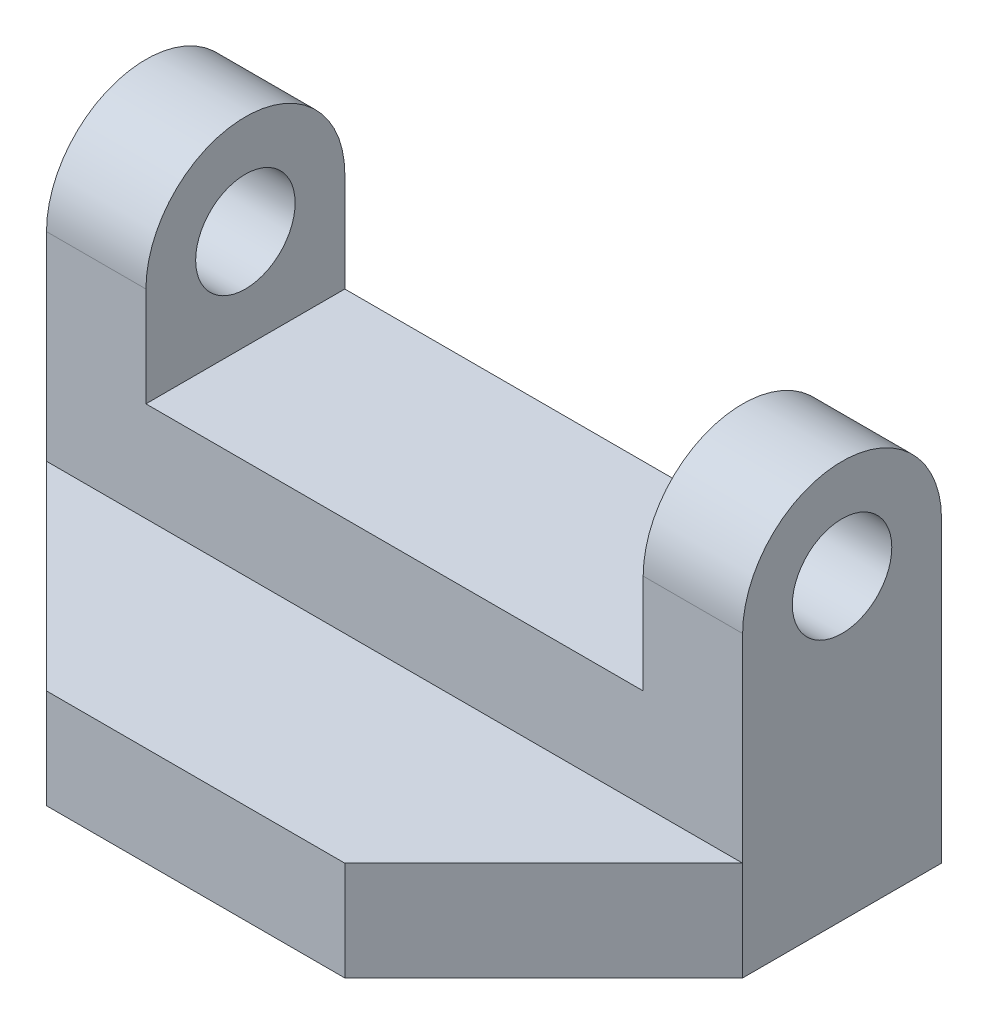
ISO-10303-21;
HEADER;
FILE_DESCRIPTION(('STEP AP214'),'2;1');
FILE_NAME('part.step','',(''),(''),'','','');
FILE_SCHEMA(('AUTOMOTIVE_DESIGN { 1 0 10303 214 1 1 1 1 }'));
ENDSEC;
DATA;
#1=APPLICATION_CONTEXT('core data for automotive mechanical design processes');
#2=APPLICATION_PROTOCOL_DEFINITION('international standard','automotive_design',2000,#1);
#3=PRODUCT_CONTEXT('',#1,'mechanical');
#4=PRODUCT('Part','Part','',(#3));
#5=PRODUCT_RELATED_PRODUCT_CATEGORY('part','',(#4));
#6=PRODUCT_DEFINITION_FORMATION('','',#4);
#7=PRODUCT_DEFINITION_CONTEXT('part definition',#1,'design');
#8=PRODUCT_DEFINITION('design','',#6,#7);
#9=PRODUCT_DEFINITION_SHAPE('','',#8);
#10=(LENGTH_UNIT() NAMED_UNIT(*) SI_UNIT(.MILLI.,.METRE.));
#11=(NAMED_UNIT(*) PLANE_ANGLE_UNIT() SI_UNIT($,.RADIAN.));
#12=(NAMED_UNIT(*) SI_UNIT($,.STERADIAN.) SOLID_ANGLE_UNIT());
#13=UNCERTAINTY_MEASURE_WITH_UNIT(LENGTH_MEASURE(1.E-05),#10,'distance_accuracy_value','');
#14=(GEOMETRIC_REPRESENTATION_CONTEXT(3) GLOBAL_UNCERTAINTY_ASSIGNED_CONTEXT((#13)) GLOBAL_UNIT_ASSIGNED_CONTEXT((#10,
#11,#12)) REPRESENTATION_CONTEXT('',''));
#15=CARTESIAN_POINT('',(0.,0.,0.));
#16=DIRECTION('',(0.,0.,1.));
#17=DIRECTION('',(1.,0.,0.));
#18=AXIS2_PLACEMENT_3D('',#15,#16,#17);
#19=CARTESIAN_POINT('',(0.,30.,-10.));
#20=DIRECTION('',(1.,0.,0.));
#21=DIRECTION('',(0.,0.,-1.));
#22=AXIS2_PLACEMENT_3D('',#19,#20,#21);
#23=CYLINDRICAL_SURFACE('',#22,10.);
#24=DIRECTION('',(1.,0.,0.));
#25=VECTOR('',#24,1.);
#26=CARTESIAN_POINT('',(0.,30.,-20.));
#27=LINE('',#26,#25);
#28=CARTESIAN_POINT('',(0.,30.,-20.));
#29=VERTEX_POINT('',#28);
#30=CARTESIAN_POINT('',(10.,30.,-20.));
#31=VERTEX_POINT('',#30);
#32=EDGE_CURVE('E216',#29,#31,#27,.T.);
#33=ORIENTED_EDGE('',*,*,#32,.F.);
#34=CARTESIAN_POINT('',(0.,30.,-10.));
#35=DIRECTION('',(-1.,0.,0.));
#36=DIRECTION('',(0.,0.,1.));
#37=AXIS2_PLACEMENT_3D('',#34,#35,#36);
#38=CIRCLE('',#37,10.);
#39=CARTESIAN_POINT('',(0.,30.,0.));
#40=VERTEX_POINT('',#39);
#41=EDGE_CURVE('E49',#40,#29,#38,.T.);
#42=ORIENTED_EDGE('',*,*,#41,.F.);
#43=DIRECTION('',(-1.,0.,0.));
#44=VECTOR('',#43,1.);
#45=CARTESIAN_POINT('',(0.,30.,0.));
#46=LINE('',#45,#44);
#47=CARTESIAN_POINT('',(10.,30.,0.));
#48=VERTEX_POINT('',#47);
#49=EDGE_CURVE('E218',#48,#40,#46,.T.);
#50=ORIENTED_EDGE('',*,*,#49,.F.);
#51=CARTESIAN_POINT('',(10.,30.,-10.));
#52=DIRECTION('',(1.,0.,0.));
#53=DIRECTION('',(0.,0.,-1.));
#54=AXIS2_PLACEMENT_3D('',#51,#52,#53);
#55=CIRCLE('',#54,10.);
#56=EDGE_CURVE('E11',#31,#48,#55,.T.);
#57=ORIENTED_EDGE('',*,*,#56,.F.);
#58=EDGE_LOOP('',(#33,#42,#50,#57));
#59=FACE_BOUND('',#58,.T.);
#60=ADVANCED_FACE('F41',(#59),#23,.T.);
#61=CARTESIAN_POINT('',(70.,30.,-10.));
#62=DIRECTION('',(1.,0.,0.));
#63=DIRECTION('',(0.,0.,-1.));
#64=AXIS2_PLACEMENT_3D('',#61,#62,#63);
#65=CYLINDRICAL_SURFACE('',#64,10.);
#66=DIRECTION('',(-1.,0.,0.));
#67=VECTOR('',#66,1.);
#68=CARTESIAN_POINT('',(70.,30.,0.));
#69=LINE('',#68,#67);
#70=CARTESIAN_POINT('',(70.,30.,0.));
#71=VERTEX_POINT('',#70);
#72=CARTESIAN_POINT('',(60.,30.,0.));
#73=VERTEX_POINT('',#72);
#74=EDGE_CURVE('E207',#71,#73,#69,.T.);
#75=ORIENTED_EDGE('',*,*,#74,.F.);
#76=CARTESIAN_POINT('',(70.,30.,-10.));
#77=DIRECTION('',(1.,0.,0.));
#78=DIRECTION('',(0.,0.,-1.));
#79=AXIS2_PLACEMENT_3D('',#76,#77,#78);
#80=CIRCLE('',#79,10.);
#81=CARTESIAN_POINT('',(70.,30.,-20.));
#82=VERTEX_POINT('',#81);
#83=EDGE_CURVE('E212',#82,#71,#80,.T.);
#84=ORIENTED_EDGE('',*,*,#83,.F.);
#85=DIRECTION('',(1.,0.,0.));
#86=VECTOR('',#85,1.);
#87=CARTESIAN_POINT('',(0.,30.,-20.));
#88=LINE('',#87,#86);
#89=CARTESIAN_POINT('',(60.,30.,-20.));
#90=VERTEX_POINT('',#89);
#91=EDGE_CURVE('E210',#90,#82,#88,.T.);
#92=ORIENTED_EDGE('',*,*,#91,.F.);
#93=CARTESIAN_POINT('',(60.,30.,-10.));
#94=DIRECTION('',(1.,0.,0.));
#95=DIRECTION('',(0.,0.,-1.));
#96=AXIS2_PLACEMENT_3D('',#93,#94,#95);
#97=CIRCLE('',#96,10.);
#98=EDGE_CURVE('E214',#73,#90,#97,.F.);
#99=ORIENTED_EDGE('',*,*,#98,.F.);
#100=EDGE_LOOP('',(#75,#84,#92,#99));
#101=FACE_BOUND('',#100,.T.);
#102=ADVANCED_FACE('F247',(#101),#65,.T.);
#103=CARTESIAN_POINT('',(0.,10.,0.));
#104=DIRECTION('',(-0.707106781186547,0.,0.707106781186548));
#105=DIRECTION('',(0.707106781186548,0.,0.707106781186547));
#106=AXIS2_PLACEMENT_3D('',#103,#104,#105);
#107=PLANE('',#106);
#108=DIRECTION('',(-0.707106781186548,0.,-0.707106781186547));
#109=VECTOR('',#108,1.);
#110=CARTESIAN_POINT('',(0.,0.,0.));
#111=LINE('',#110,#109);
#112=CARTESIAN_POINT('',(20.,0.,20.));
#113=VERTEX_POINT('',#112);
#114=CARTESIAN_POINT('',(0.,0.,0.));
#115=VERTEX_POINT('',#114);
#116=EDGE_CURVE('E149',#113,#115,#111,.T.);
#117=ORIENTED_EDGE('',*,*,#116,.F.);
#118=DIRECTION('',(0.,-1.,0.));
#119=VECTOR('',#118,1.);
#120=CARTESIAN_POINT('',(20.,10.,20.));
#121=LINE('',#120,#119);
#122=CARTESIAN_POINT('',(20.,10.,20.));
#123=VERTEX_POINT('',#122);
#124=EDGE_CURVE('E205',#123,#113,#121,.T.);
#125=ORIENTED_EDGE('',*,*,#124,.F.);
#126=DIRECTION('',(-0.707106781186548,0.,-0.707106781186547));
#127=VECTOR('',#126,1.);
#128=CARTESIAN_POINT('',(0.,10.,0.));
#129=LINE('',#128,#127);
#130=CARTESIAN_POINT('',(0.,10.,0.));
#131=VERTEX_POINT('',#130);
#132=EDGE_CURVE('E180',#123,#131,#129,.T.);
#133=ORIENTED_EDGE('',*,*,#132,.T.);
#134=DIRECTION('',(0.,-1.,0.));
#135=VECTOR('',#134,1.);
#136=CARTESIAN_POINT('',(0.,10.,0.));
#137=LINE('',#136,#135);
#138=EDGE_CURVE('E193',#131,#115,#137,.T.);
#139=ORIENTED_EDGE('',*,*,#138,.T.);
#140=EDGE_LOOP('',(#117,#125,#133,#139));
#141=FACE_BOUND('',#140,.T.);
#142=ADVANCED_FACE('F226',(#141),#107,.T.);
#143=CARTESIAN_POINT('',(0.,10.,20.));
#144=DIRECTION('',(0.,0.,1.));
#145=DIRECTION('',(1.,0.,0.));
#146=AXIS2_PLACEMENT_3D('',#143,#144,#145);
#147=PLANE('',#146);
#148=DIRECTION('',(-1.,0.,0.));
#149=VECTOR('',#148,1.);
#150=CARTESIAN_POINT('',(0.,0.,20.));
#151=LINE('',#150,#149);
#152=CARTESIAN_POINT('',(50.,0.,20.));
#153=VERTEX_POINT('',#152);
#154=EDGE_CURVE('E195',#153,#113,#151,.T.);
#155=ORIENTED_EDGE('',*,*,#154,.F.);
#156=DIRECTION('',(0.,-1.,0.));
#157=VECTOR('',#156,1.);
#158=CARTESIAN_POINT('',(50.,10.,20.));
#159=LINE('',#158,#157);
#160=CARTESIAN_POINT('',(50.,10.,20.));
#161=VERTEX_POINT('',#160);
#162=EDGE_CURVE('E203',#161,#153,#159,.T.);
#163=ORIENTED_EDGE('',*,*,#162,.F.);
#164=DIRECTION('',(-1.,0.,0.));
#165=VECTOR('',#164,1.);
#166=CARTESIAN_POINT('',(0.,10.,20.));
#167=LINE('',#166,#165);
#168=EDGE_CURVE('E183',#161,#123,#167,.T.);
#169=ORIENTED_EDGE('',*,*,#168,.T.);
#170=ORIENTED_EDGE('',*,*,#124,.T.);
#171=EDGE_LOOP('',(#155,#163,#169,#170));
#172=FACE_BOUND('',#171,.T.);
#173=ADVANCED_FACE('F239',(#172),#147,.T.);
#174=CARTESIAN_POINT('',(35.,10.,35.));
#175=DIRECTION('',(0.707106781186548,0.,0.707106781186548));
#176=DIRECTION('',(0.707106781186548,0.,-0.707106781186548));
#177=AXIS2_PLACEMENT_3D('',#174,#175,#176);
#178=PLANE('',#177);
#179=DIRECTION('',(-0.707106781186548,0.,0.707106781186548));
#180=VECTOR('',#179,1.);
#181=CARTESIAN_POINT('',(35.,0.,35.));
#182=LINE('',#181,#180);
#183=CARTESIAN_POINT('',(70.,0.,0.));
#184=VERTEX_POINT('',#183);
#185=EDGE_CURVE('E184',#184,#153,#182,.T.);
#186=ORIENTED_EDGE('',*,*,#185,.F.);
#187=DIRECTION('',(0.,-1.,0.));
#188=VECTOR('',#187,1.);
#189=CARTESIAN_POINT('',(70.,10.,0.));
#190=LINE('',#189,#188);
#191=CARTESIAN_POINT('',(70.,10.,0.));
#192=VERTEX_POINT('',#191);
#193=EDGE_CURVE('E200',#192,#184,#190,.T.);
#194=ORIENTED_EDGE('',*,*,#193,.F.);
#195=DIRECTION('',(-0.707106781186548,0.,0.707106781186548));
#196=VECTOR('',#195,1.);
#197=CARTESIAN_POINT('',(35.,10.,35.));
#198=LINE('',#197,#196);
#199=EDGE_CURVE('E187',#192,#161,#198,.T.);
#200=ORIENTED_EDGE('',*,*,#199,.T.);
#201=ORIENTED_EDGE('',*,*,#162,.T.);
#202=EDGE_LOOP('',(#186,#194,#200,#201));
#203=FACE_BOUND('',#202,.T.);
#204=ADVANCED_FACE('F234',(#203),#178,.T.);
#205=CARTESIAN_POINT('',(0.,10.,0.));
#206=DIRECTION('',(0.,1.,0.));
#207=DIRECTION('',(0.,0.,1.));
#208=AXIS2_PLACEMENT_3D('',#205,#206,#207);
#209=PLANE('',#208);
#210=ORIENTED_EDGE('',*,*,#132,.F.);
#211=ORIENTED_EDGE('',*,*,#168,.F.);
#212=ORIENTED_EDGE('',*,*,#199,.F.);
#213=DIRECTION('',(1.,0.,0.));
#214=VECTOR('',#213,1.);
#215=CARTESIAN_POINT('',(0.,10.,0.));
#216=LINE('',#215,#214);
#217=EDGE_CURVE('E190',#131,#192,#216,.T.);
#218=ORIENTED_EDGE('',*,*,#217,.F.);
#219=EDGE_LOOP('',(#210,#211,#212,#218));
#220=FACE_BOUND('',#219,.T.);
#221=ADVANCED_FACE('F230',(#220),#209,.T.);
#222=CARTESIAN_POINT('',(0.,0.,0.));
#223=DIRECTION('',(0.,1.,0.));
#224=DIRECTION('',(0.,0.,1.));
#225=AXIS2_PLACEMENT_3D('',#222,#223,#224);
#226=PLANE('',#225);
#227=DIRECTION('',(0.,0.,1.));
#228=VECTOR('',#227,1.);
#229=CARTESIAN_POINT('',(70.,0.,0.));
#230=LINE('',#229,#228);
#231=CARTESIAN_POINT('',(70.,0.,-20.));
#232=VERTEX_POINT('',#231);
#233=EDGE_CURVE('E161',#232,#184,#230,.T.);
#234=ORIENTED_EDGE('',*,*,#233,.T.);
#235=ORIENTED_EDGE('',*,*,#185,.T.);
#236=ORIENTED_EDGE('',*,*,#154,.T.);
#237=ORIENTED_EDGE('',*,*,#116,.T.);
#238=DIRECTION('',(0.,0.,-1.));
#239=VECTOR('',#238,1.);
#240=CARTESIAN_POINT('',(0.,0.,0.));
#241=LINE('',#240,#239);
#242=CARTESIAN_POINT('',(0.,0.,-20.));
#243=VERTEX_POINT('',#242);
#244=EDGE_CURVE('E126',#115,#243,#241,.T.);
#245=ORIENTED_EDGE('',*,*,#244,.T.);
#246=DIRECTION('',(1.,0.,0.));
#247=VECTOR('',#246,1.);
#248=CARTESIAN_POINT('',(0.,0.,-20.));
#249=LINE('',#248,#247);
#250=EDGE_CURVE('E134',#243,#232,#249,.T.);
#251=ORIENTED_EDGE('',*,*,#250,.T.);
#252=EDGE_LOOP('',(#234,#235,#236,#237,#245,#251));
#253=FACE_BOUND('',#252,.T.);
#254=ADVANCED_FACE('F146',(#253),#226,.F.);
#255=CARTESIAN_POINT('',(0.,20.,0.));
#256=DIRECTION('',(0.,0.,-1.));
#257=DIRECTION('',(-1.,0.,0.));
#258=AXIS2_PLACEMENT_3D('',#255,#256,#257);
#259=PLANE('',#258);
#260=DIRECTION('',(0.,-1.,0.));
#261=VECTOR('',#260,1.);
#262=CARTESIAN_POINT('',(10.,40.,0.));
#263=LINE('',#262,#261);
#264=CARTESIAN_POINT('',(10.,20.,0.));
#265=VERTEX_POINT('',#264);
#266=EDGE_CURVE('E150',#48,#265,#263,.T.);
#267=ORIENTED_EDGE('',*,*,#266,.F.);
#268=ORIENTED_EDGE('',*,*,#49,.T.);
#269=DIRECTION('',(0.,-1.,0.));
#270=VECTOR('',#269,1.);
#271=CARTESIAN_POINT('',(0.,40.,0.));
#272=LINE('',#271,#270);
#273=EDGE_CURVE('E131',#40,#131,#272,.T.);
#274=ORIENTED_EDGE('',*,*,#273,.T.);
#275=ORIENTED_EDGE('',*,*,#217,.T.);
#276=DIRECTION('',(0.,-1.,0.));
#277=VECTOR('',#276,1.);
#278=CARTESIAN_POINT('',(70.,40.,0.));
#279=LINE('',#278,#277);
#280=EDGE_CURVE('E164',#71,#192,#279,.T.);
#281=ORIENTED_EDGE('',*,*,#280,.F.);
#282=ORIENTED_EDGE('',*,*,#74,.T.);
#283=DIRECTION('',(0.,-1.,0.));
#284=VECTOR('',#283,1.);
#285=CARTESIAN_POINT('',(60.,40.,0.));
#286=LINE('',#285,#284);
#287=CARTESIAN_POINT('',(60.,20.,0.));
#288=VERTEX_POINT('',#287);
#289=EDGE_CURVE('E166',#73,#288,#286,.T.);
#290=ORIENTED_EDGE('',*,*,#289,.T.);
#291=DIRECTION('',(1.,0.,0.));
#292=VECTOR('',#291,1.);
#293=CARTESIAN_POINT('',(0.,20.,0.));
#294=LINE('',#293,#292);
#295=EDGE_CURVE('E177',#265,#288,#294,.T.);
#296=ORIENTED_EDGE('',*,*,#295,.F.);
#297=EDGE_LOOP('',(#267,#268,#274,#275,#281,#282,#290,#296));
#298=FACE_BOUND('',#297,.T.);
#299=ADVANCED_FACE('F221',(#298),#259,.F.);
#300=CARTESIAN_POINT('',(0.,20.,-20.));
#301=DIRECTION('',(0.,0.,-1.));
#302=DIRECTION('',(-1.,0.,0.));
#303=AXIS2_PLACEMENT_3D('',#300,#301,#302);
#304=PLANE('',#303);
#305=DIRECTION('',(0.,-1.,0.));
#306=VECTOR('',#305,1.);
#307=CARTESIAN_POINT('',(0.,40.,-20.));
#308=LINE('',#307,#306);
#309=EDGE_CURVE('E120',#29,#243,#308,.T.);
#310=ORIENTED_EDGE('',*,*,#309,.F.);
#311=ORIENTED_EDGE('',*,*,#32,.T.);
#312=DIRECTION('',(0.,-1.,0.));
#313=VECTOR('',#312,1.);
#314=CARTESIAN_POINT('',(10.,40.,-20.));
#315=LINE('',#314,#313);
#316=CARTESIAN_POINT('',(10.,20.,-20.));
#317=VERTEX_POINT('',#316);
#318=EDGE_CURVE('E130',#31,#317,#315,.T.);
#319=ORIENTED_EDGE('',*,*,#318,.T.);
#320=DIRECTION('',(1.,0.,0.));
#321=VECTOR('',#320,1.);
#322=CARTESIAN_POINT('',(0.,20.,-20.));
#323=LINE('',#322,#321);
#324=CARTESIAN_POINT('',(60.,20.,-20.));
#325=VERTEX_POINT('',#324);
#326=EDGE_CURVE('E171',#317,#325,#323,.T.);
#327=ORIENTED_EDGE('',*,*,#326,.T.);
#328=DIRECTION('',(0.,-1.,0.));
#329=VECTOR('',#328,1.);
#330=CARTESIAN_POINT('',(60.,40.,-20.));
#331=LINE('',#330,#329);
#332=EDGE_CURVE('E143',#90,#325,#331,.T.);
#333=ORIENTED_EDGE('',*,*,#332,.F.);
#334=ORIENTED_EDGE('',*,*,#91,.T.);
#335=DIRECTION('',(0.,-1.,0.));
#336=VECTOR('',#335,1.);
#337=CARTESIAN_POINT('',(70.,40.,-20.));
#338=LINE('',#337,#336);
#339=EDGE_CURVE('E138',#82,#232,#338,.T.);
#340=ORIENTED_EDGE('',*,*,#339,.T.);
#341=ORIENTED_EDGE('',*,*,#250,.F.);
#342=EDGE_LOOP('',(#310,#311,#319,#327,#333,#334,#340,#341));
#343=FACE_BOUND('',#342,.T.);
#344=ADVANCED_FACE('F135',(#343),#304,.T.);
#345=CARTESIAN_POINT('',(0.,20.,0.));
#346=DIRECTION('',(0.,1.,0.));
#347=DIRECTION('',(0.,0.,1.));
#348=AXIS2_PLACEMENT_3D('',#345,#346,#347);
#349=PLANE('',#348);
#350=DIRECTION('',(0.,0.,1.));
#351=VECTOR('',#350,1.);
#352=CARTESIAN_POINT('',(60.,20.,0.));
#353=LINE('',#352,#351);
#354=EDGE_CURVE('E142',#325,#288,#353,.T.);
#355=ORIENTED_EDGE('',*,*,#354,.F.);
#356=ORIENTED_EDGE('',*,*,#326,.F.);
#357=DIRECTION('',(0.,0.,1.));
#358=VECTOR('',#357,1.);
#359=CARTESIAN_POINT('',(10.,20.,0.));
#360=LINE('',#359,#358);
#361=EDGE_CURVE('E174',#317,#265,#360,.T.);
#362=ORIENTED_EDGE('',*,*,#361,.T.);
#363=ORIENTED_EDGE('',*,*,#295,.T.);
#364=EDGE_LOOP('',(#355,#356,#362,#363));
#365=FACE_BOUND('',#364,.T.);
#366=ADVANCED_FACE('F259',(#365),#349,.T.);
#367=CARTESIAN_POINT('',(60.,40.,0.));
#368=DIRECTION('',(1.,0.,0.));
#369=DIRECTION('',(0.,0.,-1.));
#370=AXIS2_PLACEMENT_3D('',#367,#368,#369);
#371=PLANE('',#370);
#372=CARTESIAN_POINT('',(60.,30.,-10.));
#373=DIRECTION('',(-1.,0.,0.));
#374=DIRECTION('',(0.,0.,1.));
#375=AXIS2_PLACEMENT_3D('',#372,#373,#374);
#376=CIRCLE('',#375,5.);
#377=CARTESIAN_POINT('',(60.,30.,-5.));
#378=VERTEX_POINT('',#377);
#379=EDGE_CURVE('E151',#378,#378,#376,.T.);
#380=ORIENTED_EDGE('',*,*,#379,.F.);
#381=EDGE_LOOP('',(#380));
#382=FACE_BOUND('',#381,.T.);
#383=ORIENTED_EDGE('',*,*,#289,.F.);
#384=ORIENTED_EDGE('',*,*,#98,.T.);
#385=ORIENTED_EDGE('',*,*,#332,.T.);
#386=ORIENTED_EDGE('',*,*,#354,.T.);
#387=EDGE_LOOP('',(#383,#384,#385,#386));
#388=FACE_BOUND('',#387,.T.);
#389=ADVANCED_FACE('F264',(#382,#388),#371,.F.);
#390=CARTESIAN_POINT('',(70.,40.,0.));
#391=DIRECTION('',(1.,0.,0.));
#392=DIRECTION('',(0.,0.,-1.));
#393=AXIS2_PLACEMENT_3D('',#390,#391,#392);
#394=PLANE('',#393);
#395=CARTESIAN_POINT('',(70.,30.,-10.));
#396=DIRECTION('',(1.,0.,0.));
#397=DIRECTION('',(0.,0.,-1.));
#398=AXIS2_PLACEMENT_3D('',#395,#396,#397);
#399=CIRCLE('',#398,5.);
#400=CARTESIAN_POINT('',(70.,30.,-15.));
#401=VERTEX_POINT('',#400);
#402=EDGE_CURVE('E155',#401,#401,#399,.F.);
#403=ORIENTED_EDGE('',*,*,#402,.T.);
#404=EDGE_LOOP('',(#403));
#405=FACE_BOUND('',#404,.T.);
#406=ORIENTED_EDGE('',*,*,#339,.F.);
#407=ORIENTED_EDGE('',*,*,#83,.T.);
#408=ORIENTED_EDGE('',*,*,#280,.T.);
#409=ORIENTED_EDGE('',*,*,#193,.T.);
#410=ORIENTED_EDGE('',*,*,#233,.F.);
#411=EDGE_LOOP('',(#406,#407,#408,#409,#410));
#412=FACE_BOUND('',#411,.T.);
#413=ADVANCED_FACE('F236',(#405,#412),#394,.T.);
#414=CARTESIAN_POINT('',(10.,40.,0.));
#415=DIRECTION('',(1.,0.,0.));
#416=DIRECTION('',(0.,0.,-1.));
#417=AXIS2_PLACEMENT_3D('',#414,#415,#416);
#418=PLANE('',#417);
#419=CARTESIAN_POINT('',(10.,30.,-10.));
#420=DIRECTION('',(1.,0.,0.));
#421=DIRECTION('',(0.,0.,-1.));
#422=AXIS2_PLACEMENT_3D('',#419,#420,#421);
#423=CIRCLE('',#422,5.);
#424=CARTESIAN_POINT('',(10.,30.,-15.));
#425=VERTEX_POINT('',#424);
#426=EDGE_CURVE('E439',#425,#425,#423,.F.);
#427=ORIENTED_EDGE('',*,*,#426,.T.);
#428=EDGE_LOOP('',(#427));
#429=FACE_BOUND('',#428,.T.);
#430=ORIENTED_EDGE('',*,*,#318,.F.);
#431=ORIENTED_EDGE('',*,*,#56,.T.);
#432=ORIENTED_EDGE('',*,*,#266,.T.);
#433=ORIENTED_EDGE('',*,*,#361,.F.);
#434=EDGE_LOOP('',(#430,#431,#432,#433));
#435=FACE_BOUND('',#434,.T.);
#436=ADVANCED_FACE('F255',(#429,#435),#418,.T.);
#437=CARTESIAN_POINT('',(0.,40.,0.));
#438=DIRECTION('',(-1.,0.,0.));
#439=DIRECTION('',(0.,0.,1.));
#440=AXIS2_PLACEMENT_3D('',#437,#438,#439);
#441=PLANE('',#440);
#442=CARTESIAN_POINT('',(0.,30.,-10.));
#443=DIRECTION('',(-1.,0.,0.));
#444=DIRECTION('',(0.,0.,1.));
#445=AXIS2_PLACEMENT_3D('',#442,#443,#444);
#446=CIRCLE('',#445,5.);
#447=CARTESIAN_POINT('',(0.,30.,-5.));
#448=VERTEX_POINT('',#447);
#449=EDGE_CURVE('E440',#448,#448,#446,.T.);
#450=ORIENTED_EDGE('',*,*,#449,.F.);
#451=EDGE_LOOP('',(#450));
#452=FACE_BOUND('',#451,.T.);
#453=ORIENTED_EDGE('',*,*,#273,.F.);
#454=ORIENTED_EDGE('',*,*,#41,.T.);
#455=ORIENTED_EDGE('',*,*,#309,.T.);
#456=ORIENTED_EDGE('',*,*,#244,.F.);
#457=ORIENTED_EDGE('',*,*,#138,.F.);
#458=EDGE_LOOP('',(#453,#454,#455,#456,#457));
#459=FACE_BOUND('',#458,.T.);
#460=ADVANCED_FACE('F123',(#452,#459),#441,.T.);
#461=CARTESIAN_POINT('',(70.001,30.,-10.));
#462=DIRECTION('',(-1.,0.,0.));
#463=DIRECTION('',(0.,0.,1.));
#464=AXIS2_PLACEMENT_3D('',#461,#462,#463);
#465=CYLINDRICAL_SURFACE('',#464,5.);
#466=ORIENTED_EDGE('',*,*,#402,.F.);
#467=EDGE_LOOP('',(#466));
#468=FACE_BOUND('',#467,.T.);
#469=ORIENTED_EDGE('',*,*,#379,.T.);
#470=EDGE_LOOP('',(#469));
#471=FACE_BOUND('',#470,.T.);
#472=ADVANCED_FACE('F321',(#468,#471),#465,.F.);
#473=CARTESIAN_POINT('',(70.001,30.,-10.));
#474=DIRECTION('',(-1.,0.,0.));
#475=DIRECTION('',(0.,0.,1.));
#476=AXIS2_PLACEMENT_3D('',#473,#474,#475);
#477=CYLINDRICAL_SURFACE('',#476,5.);
#478=ORIENTED_EDGE('',*,*,#426,.F.);
#479=EDGE_LOOP('',(#478));
#480=FACE_BOUND('',#479,.T.);
#481=ORIENTED_EDGE('',*,*,#449,.T.);
#482=EDGE_LOOP('',(#481));
#483=FACE_BOUND('',#482,.T.);
#484=ADVANCED_FACE('F328',(#480,#483),#477,.F.);
#485=CLOSED_SHELL('',(#60,#102,#142,#173,#204,#221,#254,#299,#344,#366,#389,#413,#436,#460,#472,#484));
#486=MANIFOLD_SOLID_BREP('B2',#485);
#487=ADVANCED_BREP_SHAPE_REPRESENTATION('',(#18,#486),#14);
#488=SHAPE_DEFINITION_REPRESENTATION(#9,#487);
ENDSEC;
END-ISO-10303-21;
